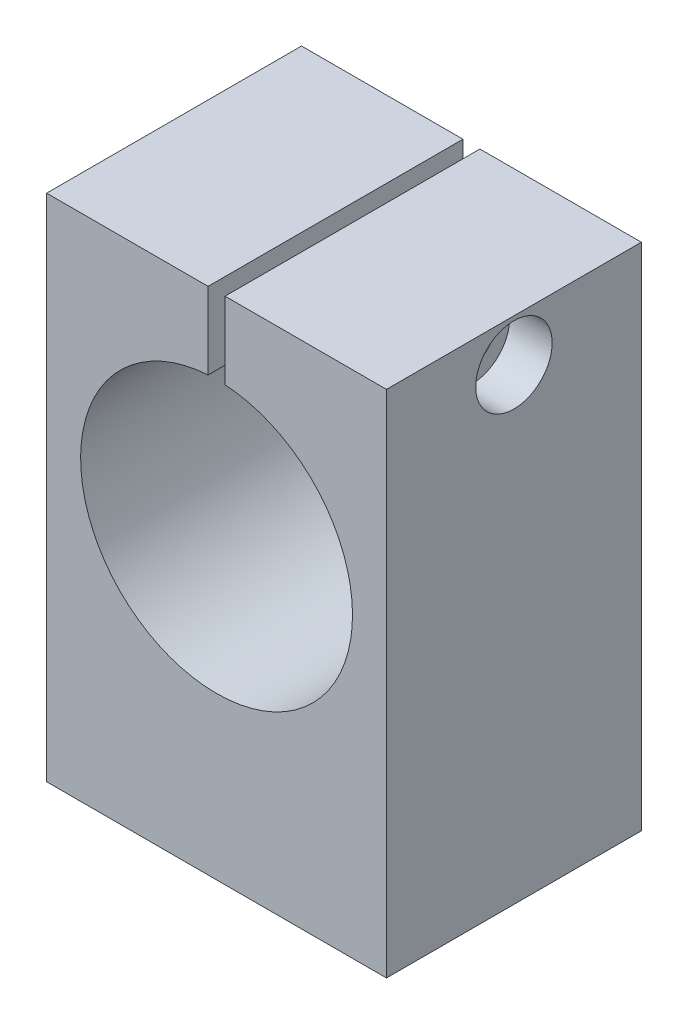
ISO-10303-21;
HEADER;
FILE_DESCRIPTION(('STEP AP214'),'2;1');
FILE_NAME('part.step','',(''),(''),'','','');
FILE_SCHEMA(('AUTOMOTIVE_DESIGN { 1 0 10303 214 1 1 1 1 }'));
ENDSEC;
DATA;
#1=APPLICATION_CONTEXT('core data for automotive mechanical design processes');
#2=APPLICATION_PROTOCOL_DEFINITION('international standard','automotive_design',2000,#1);
#3=PRODUCT_CONTEXT('',#1,'mechanical');
#4=PRODUCT('Part','Part','',(#3));
#5=PRODUCT_RELATED_PRODUCT_CATEGORY('part','',(#4));
#6=PRODUCT_DEFINITION_FORMATION('','',#4);
#7=PRODUCT_DEFINITION_CONTEXT('part definition',#1,'design');
#8=PRODUCT_DEFINITION('design','',#6,#7);
#9=PRODUCT_DEFINITION_SHAPE('','',#8);
#10=(LENGTH_UNIT() NAMED_UNIT(*) SI_UNIT(.MILLI.,.METRE.));
#11=(NAMED_UNIT(*) PLANE_ANGLE_UNIT() SI_UNIT($,.RADIAN.));
#12=(NAMED_UNIT(*) SI_UNIT($,.STERADIAN.) SOLID_ANGLE_UNIT());
#13=UNCERTAINTY_MEASURE_WITH_UNIT(LENGTH_MEASURE(1.E-05),#10,'distance_accuracy_value','');
#14=(GEOMETRIC_REPRESENTATION_CONTEXT(3) GLOBAL_UNCERTAINTY_ASSIGNED_CONTEXT((#13)) GLOBAL_UNIT_ASSIGNED_CONTEXT((#10,
#11,#12)) REPRESENTATION_CONTEXT('',''));
#15=CARTESIAN_POINT('',(0.,0.,0.));
#16=DIRECTION('',(0.,0.,1.));
#17=DIRECTION('',(1.,0.,0.));
#18=AXIS2_PLACEMENT_3D('',#15,#16,#17);
#19=CARTESIAN_POINT('',(0.999999999999988,30.,30.));
#20=DIRECTION('',(0.,-1.,0.));
#21=DIRECTION('',(0.,0.,-1.));
#22=AXIS2_PLACEMENT_3D('',#19,#20,#21);
#23=PLANE('',#22);
#24=DIRECTION('',(-1.,0.,0.));
#25=VECTOR('',#24,1.);
#26=CARTESIAN_POINT('',(0.999999999999988,30.,0.));
#27=LINE('',#26,#25);
#28=CARTESIAN_POINT('',(20.,30.,0.));
#29=VERTEX_POINT('',#28);
#30=CARTESIAN_POINT('',(0.999999999999988,30.,0.));
#31=VERTEX_POINT('',#30);
#32=EDGE_CURVE('E137',#29,#31,#27,.T.);
#33=ORIENTED_EDGE('',*,*,#32,.T.);
#34=DIRECTION('',(0.,0.,-1.));
#35=VECTOR('',#34,1.);
#36=CARTESIAN_POINT('',(0.999999999999988,30.,30.));
#37=LINE('',#36,#35);
#38=CARTESIAN_POINT('',(0.999999999999988,30.,30.));
#39=VERTEX_POINT('',#38);
#40=EDGE_CURVE('E11',#39,#31,#37,.T.);
#41=ORIENTED_EDGE('',*,*,#40,.F.);
#42=DIRECTION('',(-1.,0.,0.));
#43=VECTOR('',#42,1.);
#44=CARTESIAN_POINT('',(0.999999999999988,30.,30.));
#45=LINE('',#44,#43);
#46=CARTESIAN_POINT('',(20.,30.,30.));
#47=VERTEX_POINT('',#46);
#48=EDGE_CURVE('E152',#47,#39,#45,.T.);
#49=ORIENTED_EDGE('',*,*,#48,.F.);
#50=DIRECTION('',(0.,0.,-1.));
#51=VECTOR('',#50,1.);
#52=CARTESIAN_POINT('',(20.,30.,30.));
#53=LINE('',#52,#51);
#54=EDGE_CURVE('E133',#47,#29,#53,.T.);
#55=ORIENTED_EDGE('',*,*,#54,.T.);
#56=EDGE_LOOP('',(#33,#41,#49,#55));
#57=FACE_BOUND('',#56,.T.);
#58=ADVANCED_FACE('F38',(#57),#23,.F.);
#59=CARTESIAN_POINT('',(0.999999999999991,20.9687194226713,30.));
#60=DIRECTION('',(1.,0.,0.));
#61=DIRECTION('',(0.,1.,0.));
#62=AXIS2_PLACEMENT_3D('',#59,#60,#61);
#63=PLANE('',#62);
#64=CARTESIAN_POINT('',(0.99999999999999,25.,15.));
#65=DIRECTION('',(1.,0.,0.));
#66=DIRECTION('',(0.,1.,0.));
#67=AXIS2_PLACEMENT_3D('',#64,#65,#66);
#68=CIRCLE('',#67,2.64999999999999);
#69=CARTESIAN_POINT('',(0.99999999999999,27.65,15.));
#70=VERTEX_POINT('',#69);
#71=EDGE_CURVE('E208',#70,#70,#68,.T.);
#72=ORIENTED_EDGE('',*,*,#71,.T.);
#73=EDGE_LOOP('',(#72));
#74=FACE_BOUND('',#73,.T.);
#75=DIRECTION('',(0.,-1.,0.));
#76=VECTOR('',#75,1.);
#77=CARTESIAN_POINT('',(0.999999999999991,20.9687194226713,0.));
#78=LINE('',#77,#76);
#79=CARTESIAN_POINT('',(0.999999999999992,20.9687194226713,0.));
#80=VERTEX_POINT('',#79);
#81=EDGE_CURVE('E140',#31,#80,#78,.T.);
#82=ORIENTED_EDGE('',*,*,#81,.T.);
#83=DIRECTION('',(0.,0.,-1.));
#84=VECTOR('',#83,1.);
#85=CARTESIAN_POINT('',(0.999999999999992,20.9687194226713,30.));
#86=LINE('',#85,#84);
#87=CARTESIAN_POINT('',(0.999999999999992,20.9687194226713,30.));
#88=VERTEX_POINT('',#87);
#89=EDGE_CURVE('E46',#88,#80,#86,.T.);
#90=ORIENTED_EDGE('',*,*,#89,.F.);
#91=DIRECTION('',(0.,-1.,0.));
#92=VECTOR('',#91,1.);
#93=CARTESIAN_POINT('',(0.999999999999991,20.9687194226713,30.));
#94=LINE('',#93,#92);
#95=EDGE_CURVE('E98',#39,#88,#94,.T.);
#96=ORIENTED_EDGE('',*,*,#95,.F.);
#97=ORIENTED_EDGE('',*,*,#40,.T.);
#98=EDGE_LOOP('',(#82,#90,#96,#97));
#99=FACE_BOUND('',#98,.T.);
#100=ADVANCED_FACE('F240',(#74,#99),#63,.F.);
#101=CARTESIAN_POINT('',(0.,5.,30.));
#102=DIRECTION('',(0.,0.,-1.));
#103=DIRECTION('',(-1.,0.,0.));
#104=AXIS2_PLACEMENT_3D('',#101,#102,#103);
#105=CYLINDRICAL_SURFACE('',#104,16.);
#106=CARTESIAN_POINT('',(0.,5.,0.));
#107=DIRECTION('',(0.,0.,-1.));
#108=DIRECTION('',(1.,0.,0.));
#109=AXIS2_PLACEMENT_3D('',#106,#107,#108);
#110=CIRCLE('',#109,16.);
#111=CARTESIAN_POINT('',(-1.,20.9687194226713,0.));
#112=VERTEX_POINT('',#111);
#113=EDGE_CURVE('E143',#80,#112,#110,.T.);
#114=ORIENTED_EDGE('',*,*,#113,.T.);
#115=DIRECTION('',(0.,0.,-1.));
#116=VECTOR('',#115,1.);
#117=CARTESIAN_POINT('',(-1.,20.9687194226713,30.));
#118=LINE('',#117,#116);
#119=CARTESIAN_POINT('',(-1.,20.9687194226713,30.));
#120=VERTEX_POINT('',#119);
#121=EDGE_CURVE('E159',#120,#112,#118,.T.);
#122=ORIENTED_EDGE('',*,*,#121,.F.);
#123=CARTESIAN_POINT('',(0.,5.,30.));
#124=DIRECTION('',(0.,0.,-1.));
#125=DIRECTION('',(1.,0.,0.));
#126=AXIS2_PLACEMENT_3D('',#123,#124,#125);
#127=CIRCLE('',#126,16.);
#128=EDGE_CURVE('E167',#88,#120,#127,.T.);
#129=ORIENTED_EDGE('',*,*,#128,.F.);
#130=ORIENTED_EDGE('',*,*,#89,.T.);
#131=EDGE_LOOP('',(#114,#122,#129,#130));
#132=FACE_BOUND('',#131,.T.);
#133=ADVANCED_FACE('F165',(#132),#105,.F.);
#134=CARTESIAN_POINT('',(-1.,20.9687194226713,30.));
#135=DIRECTION('',(-1.,0.,0.));
#136=DIRECTION('',(0.,-1.,0.));
#137=AXIS2_PLACEMENT_3D('',#134,#135,#136);
#138=PLANE('',#137);
#139=CARTESIAN_POINT('',(-1.,25.,15.));
#140=DIRECTION('',(-1.,0.,0.));
#141=DIRECTION('',(0.,-1.,0.));
#142=AXIS2_PLACEMENT_3D('',#139,#140,#141);
#143=CIRCLE('',#142,2.24999999999999);
#144=CARTESIAN_POINT('',(-1.,22.75,15.));
#145=VERTEX_POINT('',#144);
#146=EDGE_CURVE('E220',#145,#145,#143,.T.);
#147=ORIENTED_EDGE('',*,*,#146,.T.);
#148=EDGE_LOOP('',(#147));
#149=FACE_BOUND('',#148,.T.);
#150=DIRECTION('',(0.,1.,0.));
#151=VECTOR('',#150,1.);
#152=CARTESIAN_POINT('',(-1.,20.9687194226713,0.));
#153=LINE('',#152,#151);
#154=CARTESIAN_POINT('',(-1.00000000000001,30.,0.));
#155=VERTEX_POINT('',#154);
#156=EDGE_CURVE('E145',#112,#155,#153,.T.);
#157=ORIENTED_EDGE('',*,*,#156,.T.);
#158=DIRECTION('',(0.,0.,-1.));
#159=VECTOR('',#158,1.);
#160=CARTESIAN_POINT('',(-1.00000000000001,30.,30.));
#161=LINE('',#160,#159);
#162=CARTESIAN_POINT('',(-1.00000000000001,30.,30.));
#163=VERTEX_POINT('',#162);
#164=EDGE_CURVE('E156',#163,#155,#161,.T.);
#165=ORIENTED_EDGE('',*,*,#164,.F.);
#166=DIRECTION('',(0.,1.,0.));
#167=VECTOR('',#166,1.);
#168=CARTESIAN_POINT('',(-1.,20.9687194226713,30.));
#169=LINE('',#168,#167);
#170=EDGE_CURVE('E179',#120,#163,#169,.T.);
#171=ORIENTED_EDGE('',*,*,#170,.F.);
#172=ORIENTED_EDGE('',*,*,#121,.T.);
#173=EDGE_LOOP('',(#157,#165,#171,#172));
#174=FACE_BOUND('',#173,.T.);
#175=ADVANCED_FACE('F175',(#149,#174),#138,.F.);
#176=CARTESIAN_POINT('',(-20.,30.,30.));
#177=DIRECTION('',(0.,-1.,0.));
#178=DIRECTION('',(0.,0.,-1.));
#179=AXIS2_PLACEMENT_3D('',#176,#177,#178);
#180=PLANE('',#179);
#181=DIRECTION('',(-1.,0.,0.));
#182=VECTOR('',#181,1.);
#183=CARTESIAN_POINT('',(-20.,30.,0.));
#184=LINE('',#183,#182);
#185=CARTESIAN_POINT('',(-20.,30.,0.));
#186=VERTEX_POINT('',#185);
#187=EDGE_CURVE('E147',#155,#186,#184,.T.);
#188=ORIENTED_EDGE('',*,*,#187,.T.);
#189=DIRECTION('',(0.,0.,-1.));
#190=VECTOR('',#189,1.);
#191=CARTESIAN_POINT('',(-20.,30.,30.));
#192=LINE('',#191,#190);
#193=CARTESIAN_POINT('',(-20.,30.,30.));
#194=VERTEX_POINT('',#193);
#195=EDGE_CURVE('E128',#194,#186,#192,.T.);
#196=ORIENTED_EDGE('',*,*,#195,.F.);
#197=DIRECTION('',(-1.,0.,0.));
#198=VECTOR('',#197,1.);
#199=CARTESIAN_POINT('',(-20.,30.,30.));
#200=LINE('',#199,#198);
#201=EDGE_CURVE('E119',#163,#194,#200,.T.);
#202=ORIENTED_EDGE('',*,*,#201,.F.);
#203=ORIENTED_EDGE('',*,*,#164,.T.);
#204=EDGE_LOOP('',(#188,#196,#202,#203));
#205=FACE_BOUND('',#204,.T.);
#206=ADVANCED_FACE('F178',(#205),#180,.F.);
#207=CARTESIAN_POINT('',(-20.,-30.,30.));
#208=DIRECTION('',(1.,0.,0.));
#209=DIRECTION('',(0.,0.,-1.));
#210=AXIS2_PLACEMENT_3D('',#207,#208,#209);
#211=PLANE('',#210);
#212=CARTESIAN_POINT('',(-20.,25.,15.));
#213=DIRECTION('',(-1.,0.,0.));
#214=DIRECTION('',(0.,0.,1.));
#215=AXIS2_PLACEMENT_3D('',#212,#213,#214);
#216=CIRCLE('',#215,2.24999999999999);
#217=CARTESIAN_POINT('',(-20.,25.,17.25));
#218=VERTEX_POINT('',#217);
#219=EDGE_CURVE('E223',#218,#218,#216,.T.);
#220=ORIENTED_EDGE('',*,*,#219,.F.);
#221=EDGE_LOOP('',(#220));
#222=FACE_BOUND('',#221,.T.);
#223=DIRECTION('',(0.,-1.,0.));
#224=VECTOR('',#223,1.);
#225=CARTESIAN_POINT('',(-20.,-30.,0.));
#226=LINE('',#225,#224);
#227=CARTESIAN_POINT('',(-20.,-30.,0.));
#228=VERTEX_POINT('',#227);
#229=EDGE_CURVE('E127',#186,#228,#226,.T.);
#230=ORIENTED_EDGE('',*,*,#229,.T.);
#231=DIRECTION('',(0.,0.,-1.));
#232=VECTOR('',#231,1.);
#233=CARTESIAN_POINT('',(-20.,-30.,30.));
#234=LINE('',#233,#232);
#235=CARTESIAN_POINT('',(-20.,-30.,30.));
#236=VERTEX_POINT('',#235);
#237=EDGE_CURVE('E124',#236,#228,#234,.T.);
#238=ORIENTED_EDGE('',*,*,#237,.F.);
#239=DIRECTION('',(0.,-1.,0.));
#240=VECTOR('',#239,1.);
#241=CARTESIAN_POINT('',(-20.,-30.,30.));
#242=LINE('',#241,#240);
#243=EDGE_CURVE('E113',#194,#236,#242,.T.);
#244=ORIENTED_EDGE('',*,*,#243,.F.);
#245=ORIENTED_EDGE('',*,*,#195,.T.);
#246=EDGE_LOOP('',(#230,#238,#244,#245));
#247=FACE_BOUND('',#246,.T.);
#248=ADVANCED_FACE('F125',(#222,#247),#211,.F.);
#249=CARTESIAN_POINT('',(-20.,-30.,30.));
#250=DIRECTION('',(0.,1.,0.));
#251=DIRECTION('',(0.,0.,1.));
#252=AXIS2_PLACEMENT_3D('',#249,#250,#251);
#253=PLANE('',#252);
#254=CARTESIAN_POINT('',(15.,-30.,5.));
#255=DIRECTION('',(0.,-1.,0.));
#256=DIRECTION('',(0.,0.,-1.));
#257=AXIS2_PLACEMENT_3D('',#254,#255,#256);
#258=CIRCLE('',#257,1.65);
#259=CARTESIAN_POINT('',(15.,-30.,3.35));
#260=VERTEX_POINT('',#259);
#261=EDGE_CURVE('E205',#260,#260,#258,.T.);
#262=ORIENTED_EDGE('',*,*,#261,.F.);
#263=EDGE_LOOP('',(#262));
#264=FACE_BOUND('',#263,.T.);
#265=CARTESIAN_POINT('',(15.,-30.,25.));
#266=DIRECTION('',(0.,-1.,0.));
#267=DIRECTION('',(0.,0.,-1.));
#268=AXIS2_PLACEMENT_3D('',#265,#266,#267);
#269=CIRCLE('',#268,1.65);
#270=CARTESIAN_POINT('',(15.,-30.,23.35));
#271=VERTEX_POINT('',#270);
#272=EDGE_CURVE('E199',#271,#271,#269,.T.);
#273=ORIENTED_EDGE('',*,*,#272,.F.);
#274=EDGE_LOOP('',(#273));
#275=FACE_BOUND('',#274,.T.);
#276=CARTESIAN_POINT('',(-15.,-30.,5.));
#277=DIRECTION('',(0.,-1.,0.));
#278=DIRECTION('',(0.,0.,-1.));
#279=AXIS2_PLACEMENT_3D('',#276,#277,#278);
#280=CIRCLE('',#279,1.65);
#281=CARTESIAN_POINT('',(-15.,-30.,3.35));
#282=VERTEX_POINT('',#281);
#283=EDGE_CURVE('E193',#282,#282,#280,.T.);
#284=ORIENTED_EDGE('',*,*,#283,.F.);
#285=EDGE_LOOP('',(#284));
#286=FACE_BOUND('',#285,.T.);
#287=CARTESIAN_POINT('',(-15.,-30.,25.));
#288=DIRECTION('',(0.,-1.,0.));
#289=DIRECTION('',(0.,0.,-1.));
#290=AXIS2_PLACEMENT_3D('',#287,#288,#289);
#291=CIRCLE('',#290,1.65);
#292=CARTESIAN_POINT('',(-15.,-30.,23.35));
#293=VERTEX_POINT('',#292);
#294=EDGE_CURVE('E187',#293,#293,#291,.T.);
#295=ORIENTED_EDGE('',*,*,#294,.F.);
#296=EDGE_LOOP('',(#295));
#297=FACE_BOUND('',#296,.T.);
#298=DIRECTION('',(1.,0.,0.));
#299=VECTOR('',#298,1.);
#300=CARTESIAN_POINT('',(-20.,-30.,0.));
#301=LINE('',#300,#299);
#302=CARTESIAN_POINT('',(20.,-30.,0.));
#303=VERTEX_POINT('',#302);
#304=EDGE_CURVE('E84',#228,#303,#301,.T.);
#305=ORIENTED_EDGE('',*,*,#304,.T.);
#306=DIRECTION('',(0.,0.,-1.));
#307=VECTOR('',#306,1.);
#308=CARTESIAN_POINT('',(20.,-30.,30.));
#309=LINE('',#308,#307);
#310=CARTESIAN_POINT('',(20.,-30.,30.));
#311=VERTEX_POINT('',#310);
#312=EDGE_CURVE('E129',#311,#303,#309,.T.);
#313=ORIENTED_EDGE('',*,*,#312,.F.);
#314=DIRECTION('',(1.,0.,0.));
#315=VECTOR('',#314,1.);
#316=CARTESIAN_POINT('',(-20.,-30.,30.));
#317=LINE('',#316,#315);
#318=EDGE_CURVE('E117',#236,#311,#317,.T.);
#319=ORIENTED_EDGE('',*,*,#318,.F.);
#320=ORIENTED_EDGE('',*,*,#237,.T.);
#321=EDGE_LOOP('',(#305,#313,#319,#320));
#322=FACE_BOUND('',#321,.T.);
#323=ADVANCED_FACE('F131',(#264,#275,#286,#297,#322),#253,.F.);
#324=CARTESIAN_POINT('',(20.,-30.,30.));
#325=DIRECTION('',(-1.,0.,0.));
#326=DIRECTION('',(0.,0.,1.));
#327=AXIS2_PLACEMENT_3D('',#324,#325,#326);
#328=PLANE('',#327);
#329=CARTESIAN_POINT('',(20.,25.,15.));
#330=DIRECTION('',(1.,0.,0.));
#331=DIRECTION('',(0.,0.,-1.));
#332=AXIS2_PLACEMENT_3D('',#329,#330,#331);
#333=CIRCLE('',#332,4.5);
#334=CARTESIAN_POINT('',(20.,25.,10.5));
#335=VERTEX_POINT('',#334);
#336=EDGE_CURVE('E217',#335,#335,#333,.T.);
#337=ORIENTED_EDGE('',*,*,#336,.F.);
#338=EDGE_LOOP('',(#337));
#339=FACE_BOUND('',#338,.T.);
#340=DIRECTION('',(0.,1.,0.));
#341=VECTOR('',#340,1.);
#342=CARTESIAN_POINT('',(20.,-30.,0.));
#343=LINE('',#342,#341);
#344=EDGE_CURVE('E90',#303,#29,#343,.T.);
#345=ORIENTED_EDGE('',*,*,#344,.T.);
#346=ORIENTED_EDGE('',*,*,#54,.F.);
#347=DIRECTION('',(0.,1.,0.));
#348=VECTOR('',#347,1.);
#349=CARTESIAN_POINT('',(20.,-30.,30.));
#350=LINE('',#349,#348);
#351=EDGE_CURVE('E54',#311,#47,#350,.T.);
#352=ORIENTED_EDGE('',*,*,#351,.F.);
#353=ORIENTED_EDGE('',*,*,#312,.T.);
#354=EDGE_LOOP('',(#345,#346,#352,#353));
#355=FACE_BOUND('',#354,.T.);
#356=ADVANCED_FACE('F235',(#339,#355),#328,.F.);
#357=CARTESIAN_POINT('',(0.,5.,30.));
#358=DIRECTION('',(0.,0.,1.));
#359=DIRECTION('',(1.,0.,0.));
#360=AXIS2_PLACEMENT_3D('',#357,#358,#359);
#361=PLANE('',#360);
#362=ORIENTED_EDGE('',*,*,#48,.T.);
#363=ORIENTED_EDGE('',*,*,#95,.T.);
#364=ORIENTED_EDGE('',*,*,#128,.T.);
#365=ORIENTED_EDGE('',*,*,#170,.T.);
#366=ORIENTED_EDGE('',*,*,#201,.T.);
#367=ORIENTED_EDGE('',*,*,#243,.T.);
#368=ORIENTED_EDGE('',*,*,#318,.T.);
#369=ORIENTED_EDGE('',*,*,#351,.T.);
#370=EDGE_LOOP('',(#362,#363,#364,#365,#366,#367,#368,#369));
#371=FACE_BOUND('',#370,.T.);
#372=ADVANCED_FACE('F115',(#371),#361,.T.);
#373=CARTESIAN_POINT('',(0.,5.,0.));
#374=DIRECTION('',(0.,0.,1.));
#375=DIRECTION('',(1.,0.,0.));
#376=AXIS2_PLACEMENT_3D('',#373,#374,#375);
#377=PLANE('',#376);
#378=ORIENTED_EDGE('',*,*,#32,.F.);
#379=ORIENTED_EDGE('',*,*,#344,.F.);
#380=ORIENTED_EDGE('',*,*,#304,.F.);
#381=ORIENTED_EDGE('',*,*,#229,.F.);
#382=ORIENTED_EDGE('',*,*,#187,.F.);
#383=ORIENTED_EDGE('',*,*,#156,.F.);
#384=ORIENTED_EDGE('',*,*,#113,.F.);
#385=ORIENTED_EDGE('',*,*,#81,.F.);
#386=EDGE_LOOP('',(#378,#379,#380,#381,#382,#383,#384,#385));
#387=FACE_BOUND('',#386,.T.);
#388=ADVANCED_FACE('F171',(#387),#377,.F.);
#389=CARTESIAN_POINT('',(-15.,-15.,25.));
#390=DIRECTION('',(0.,-1.,0.));
#391=DIRECTION('',(0.,0.,-1.));
#392=AXIS2_PLACEMENT_3D('',#389,#390,#391);
#393=CONICAL_SURFACE('',#392,1.65,1.02974425867665);
#394=CARTESIAN_POINT('',(-15.,-14.0085799786045,25.));
#395=VERTEX_POINT('',#394);
#396=VERTEX_LOOP('',#395);
#397=FACE_BOUND('',#396,.T.);
#398=CARTESIAN_POINT('',(-15.,-15.,25.));
#399=DIRECTION('',(0.,-1.,0.));
#400=DIRECTION('',(0.,0.,-1.));
#401=AXIS2_PLACEMENT_3D('',#398,#399,#400);
#402=CIRCLE('',#401,1.65);
#403=CARTESIAN_POINT('',(-15.,-15.,23.35));
#404=VERTEX_POINT('',#403);
#405=EDGE_CURVE('E141',#404,#404,#402,.T.);
#406=ORIENTED_EDGE('',*,*,#405,.T.);
#407=EDGE_LOOP('',(#406));
#408=FACE_BOUND('',#407,.T.);
#409=ADVANCED_FACE('F258',(#397,#408),#393,.F.);
#410=CARTESIAN_POINT('',(-15.,-30.,25.));
#411=DIRECTION('',(0.,-1.,0.));
#412=DIRECTION('',(0.,0.,-1.));
#413=AXIS2_PLACEMENT_3D('',#410,#411,#412);
#414=CYLINDRICAL_SURFACE('',#413,1.65);
#415=ORIENTED_EDGE('',*,*,#405,.F.);
#416=EDGE_LOOP('',(#415));
#417=FACE_BOUND('',#416,.T.);
#418=ORIENTED_EDGE('',*,*,#294,.T.);
#419=EDGE_LOOP('',(#418));
#420=FACE_BOUND('',#419,.T.);
#421=ADVANCED_FACE('F262',(#417,#420),#414,.F.);
#422=CARTESIAN_POINT('',(-15.,-15.,5.));
#423=DIRECTION('',(0.,-1.,0.));
#424=DIRECTION('',(0.,0.,-1.));
#425=AXIS2_PLACEMENT_3D('',#422,#423,#424);
#426=CONICAL_SURFACE('',#425,1.65,1.02974425867665);
#427=CARTESIAN_POINT('',(-15.,-14.0085799786045,5.));
#428=VERTEX_POINT('',#427);
#429=VERTEX_LOOP('',#428);
#430=FACE_BOUND('',#429,.T.);
#431=CARTESIAN_POINT('',(-15.,-15.,5.));
#432=DIRECTION('',(0.,-1.,0.));
#433=DIRECTION('',(0.,0.,-1.));
#434=AXIS2_PLACEMENT_3D('',#431,#432,#433);
#435=CIRCLE('',#434,1.65);
#436=CARTESIAN_POINT('',(-15.,-15.,3.35));
#437=VERTEX_POINT('',#436);
#438=EDGE_CURVE('E190',#437,#437,#435,.T.);
#439=ORIENTED_EDGE('',*,*,#438,.T.);
#440=EDGE_LOOP('',(#439));
#441=FACE_BOUND('',#440,.T.);
#442=ADVANCED_FACE('F266',(#430,#441),#426,.F.);
#443=CARTESIAN_POINT('',(-15.,-30.,5.));
#444=DIRECTION('',(0.,-1.,0.));
#445=DIRECTION('',(0.,0.,-1.));
#446=AXIS2_PLACEMENT_3D('',#443,#444,#445);
#447=CYLINDRICAL_SURFACE('',#446,1.65);
#448=ORIENTED_EDGE('',*,*,#438,.F.);
#449=EDGE_LOOP('',(#448));
#450=FACE_BOUND('',#449,.T.);
#451=ORIENTED_EDGE('',*,*,#283,.T.);
#452=EDGE_LOOP('',(#451));
#453=FACE_BOUND('',#452,.T.);
#454=ADVANCED_FACE('F270',(#450,#453),#447,.F.);
#455=CARTESIAN_POINT('',(15.,-15.,25.));
#456=DIRECTION('',(0.,-1.,0.));
#457=DIRECTION('',(0.,0.,-1.));
#458=AXIS2_PLACEMENT_3D('',#455,#456,#457);
#459=CONICAL_SURFACE('',#458,1.65,1.02974425867665);
#460=CARTESIAN_POINT('',(15.,-14.0085799786045,25.));
#461=VERTEX_POINT('',#460);
#462=VERTEX_LOOP('',#461);
#463=FACE_BOUND('',#462,.T.);
#464=CARTESIAN_POINT('',(15.,-15.,25.));
#465=DIRECTION('',(0.,-1.,0.));
#466=DIRECTION('',(0.,0.,-1.));
#467=AXIS2_PLACEMENT_3D('',#464,#465,#466);
#468=CIRCLE('',#467,1.65);
#469=CARTESIAN_POINT('',(15.,-15.,23.35));
#470=VERTEX_POINT('',#469);
#471=EDGE_CURVE('E196',#470,#470,#468,.T.);
#472=ORIENTED_EDGE('',*,*,#471,.T.);
#473=EDGE_LOOP('',(#472));
#474=FACE_BOUND('',#473,.T.);
#475=ADVANCED_FACE('F274',(#463,#474),#459,.F.);
#476=CARTESIAN_POINT('',(15.,-30.,25.));
#477=DIRECTION('',(0.,-1.,0.));
#478=DIRECTION('',(0.,0.,-1.));
#479=AXIS2_PLACEMENT_3D('',#476,#477,#478);
#480=CYLINDRICAL_SURFACE('',#479,1.65);
#481=ORIENTED_EDGE('',*,*,#471,.F.);
#482=EDGE_LOOP('',(#481));
#483=FACE_BOUND('',#482,.T.);
#484=ORIENTED_EDGE('',*,*,#272,.T.);
#485=EDGE_LOOP('',(#484));
#486=FACE_BOUND('',#485,.T.);
#487=ADVANCED_FACE('F278',(#483,#486),#480,.F.);
#488=CARTESIAN_POINT('',(15.,-15.,5.));
#489=DIRECTION('',(0.,-1.,0.));
#490=DIRECTION('',(0.,0.,-1.));
#491=AXIS2_PLACEMENT_3D('',#488,#489,#490);
#492=CONICAL_SURFACE('',#491,1.65,1.02974425867665);
#493=CARTESIAN_POINT('',(15.,-14.0085799786045,5.));
#494=VERTEX_POINT('',#493);
#495=VERTEX_LOOP('',#494);
#496=FACE_BOUND('',#495,.T.);
#497=CARTESIAN_POINT('',(15.,-15.,5.));
#498=DIRECTION('',(0.,-1.,0.));
#499=DIRECTION('',(0.,0.,-1.));
#500=AXIS2_PLACEMENT_3D('',#497,#498,#499);
#501=CIRCLE('',#500,1.65);
#502=CARTESIAN_POINT('',(15.,-15.,3.35));
#503=VERTEX_POINT('',#502);
#504=EDGE_CURVE('E202',#503,#503,#501,.T.);
#505=ORIENTED_EDGE('',*,*,#504,.T.);
#506=EDGE_LOOP('',(#505));
#507=FACE_BOUND('',#506,.T.);
#508=ADVANCED_FACE('F282',(#496,#507),#492,.F.);
#509=CARTESIAN_POINT('',(15.,-30.,5.));
#510=DIRECTION('',(0.,-1.,0.));
#511=DIRECTION('',(0.,0.,-1.));
#512=AXIS2_PLACEMENT_3D('',#509,#510,#511);
#513=CYLINDRICAL_SURFACE('',#512,1.65);
#514=ORIENTED_EDGE('',*,*,#504,.F.);
#515=EDGE_LOOP('',(#514));
#516=FACE_BOUND('',#515,.T.);
#517=ORIENTED_EDGE('',*,*,#261,.T.);
#518=EDGE_LOOP('',(#517));
#519=FACE_BOUND('',#518,.T.);
#520=ADVANCED_FACE('F286',(#516,#519),#513,.F.);
#521=CARTESIAN_POINT('',(20.,25.,15.));
#522=DIRECTION('',(1.,0.,0.));
#523=DIRECTION('',(0.,0.,-1.));
#524=AXIS2_PLACEMENT_3D('',#521,#522,#523);
#525=CYLINDRICAL_SURFACE('',#524,4.5);
#526=CARTESIAN_POINT('',(15.,25.,15.));
#527=DIRECTION('',(1.,0.,0.));
#528=DIRECTION('',(0.,0.,-1.));
#529=AXIS2_PLACEMENT_3D('',#526,#527,#528);
#530=CIRCLE('',#529,4.5);
#531=CARTESIAN_POINT('',(15.,25.,10.5));
#532=VERTEX_POINT('',#531);
#533=EDGE_CURVE('E214',#532,#532,#530,.T.);
#534=ORIENTED_EDGE('',*,*,#533,.F.);
#535=EDGE_LOOP('',(#534));
#536=FACE_BOUND('',#535,.T.);
#537=ORIENTED_EDGE('',*,*,#336,.T.);
#538=EDGE_LOOP('',(#537));
#539=FACE_BOUND('',#538,.T.);
#540=ADVANCED_FACE('F290',(#536,#539),#525,.F.);
#541=CARTESIAN_POINT('',(15.,27.65,15.));
#542=DIRECTION('',(-1.,0.,0.));
#543=DIRECTION('',(0.,0.,1.));
#544=AXIS2_PLACEMENT_3D('',#541,#542,#543);
#545=PLANE('',#544);
#546=CARTESIAN_POINT('',(15.,25.,15.));
#547=DIRECTION('',(1.,0.,0.));
#548=DIRECTION('',(0.,0.,-1.));
#549=AXIS2_PLACEMENT_3D('',#546,#547,#548);
#550=CIRCLE('',#549,2.65);
#551=CARTESIAN_POINT('',(15.,25.,12.35));
#552=VERTEX_POINT('',#551);
#553=EDGE_CURVE('E211',#552,#552,#550,.T.);
#554=ORIENTED_EDGE('',*,*,#553,.F.);
#555=EDGE_LOOP('',(#554));
#556=FACE_BOUND('',#555,.T.);
#557=ORIENTED_EDGE('',*,*,#533,.T.);
#558=EDGE_LOOP('',(#557));
#559=FACE_BOUND('',#558,.T.);
#560=ADVANCED_FACE('F295',(#556,#559),#545,.F.);
#561=CARTESIAN_POINT('',(20.,25.,15.));
#562=DIRECTION('',(1.,0.,0.));
#563=DIRECTION('',(0.,0.,-1.));
#564=AXIS2_PLACEMENT_3D('',#561,#562,#563);
#565=CYLINDRICAL_SURFACE('',#564,2.64999999999999);
#566=ORIENTED_EDGE('',*,*,#553,.T.);
#567=EDGE_LOOP('',(#566));
#568=FACE_BOUND('',#567,.T.);
#569=ORIENTED_EDGE('',*,*,#71,.F.);
#570=EDGE_LOOP('',(#569));
#571=FACE_BOUND('',#570,.T.);
#572=ADVANCED_FACE('F292',(#568,#571),#565,.F.);
#573=CARTESIAN_POINT('',(-20.,25.,15.));
#574=DIRECTION('',(-1.,0.,0.));
#575=DIRECTION('',(0.,0.,1.));
#576=AXIS2_PLACEMENT_3D('',#573,#574,#575);
#577=CYLINDRICAL_SURFACE('',#576,2.24999999999999);
#578=ORIENTED_EDGE('',*,*,#146,.F.);
#579=EDGE_LOOP('',(#578));
#580=FACE_BOUND('',#579,.T.);
#581=ORIENTED_EDGE('',*,*,#219,.T.);
#582=EDGE_LOOP('',(#581));
#583=FACE_BOUND('',#582,.T.);
#584=ADVANCED_FACE('F227',(#580,#583),#577,.F.);
#585=CLOSED_SHELL('',(#58,#100,#133,#175,#206,#248,#323,#356,#372,#388,#409,#421,#442,#454,#475,
#487,#508,#520,#540,#560,#572,#584));
#586=MANIFOLD_SOLID_BREP('B2',#585);
#587=ADVANCED_BREP_SHAPE_REPRESENTATION('',(#18,#586),#14);
#588=SHAPE_DEFINITION_REPRESENTATION(#9,#587);
ENDSEC;
END-ISO-10303-21;
